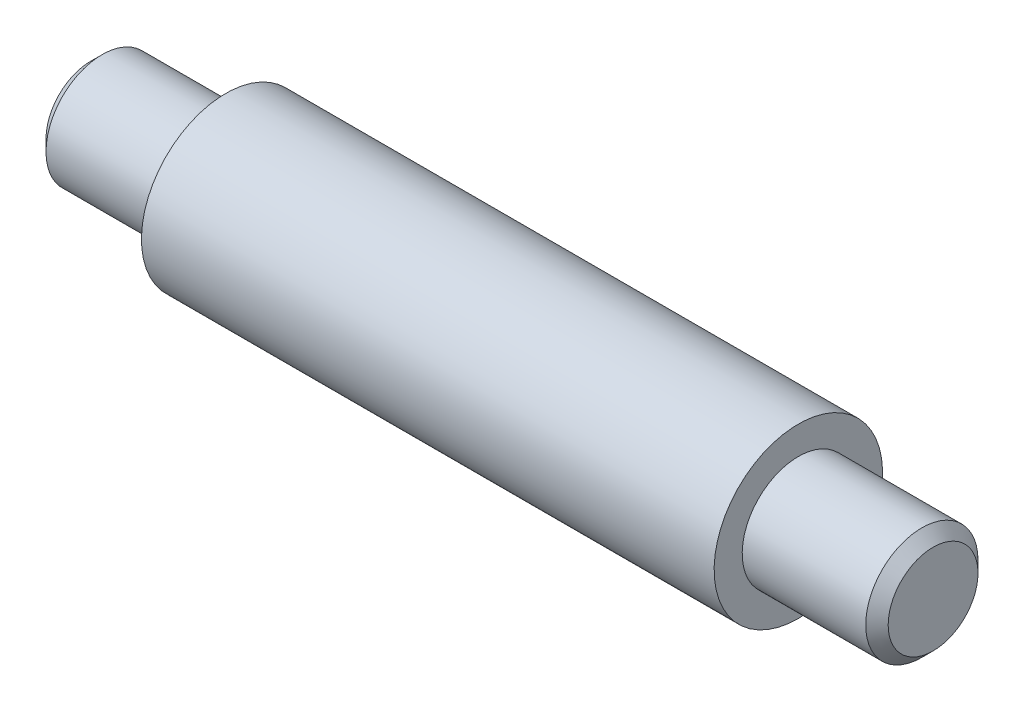
ISO-10303-21;
HEADER;
FILE_DESCRIPTION(('STEP AP214'),'2;1');
FILE_NAME('part.step','',(''),(''),'','','');
FILE_SCHEMA(('AUTOMOTIVE_DESIGN { 1 0 10303 214 1 1 1 1 }'));
ENDSEC;
DATA;
#1=APPLICATION_CONTEXT('core data for automotive mechanical design processes');
#2=APPLICATION_PROTOCOL_DEFINITION('international standard','automotive_design',2000,#1);
#3=PRODUCT_CONTEXT('',#1,'mechanical');
#4=PRODUCT('Part','Part','',(#3));
#5=PRODUCT_RELATED_PRODUCT_CATEGORY('part','',(#4));
#6=PRODUCT_DEFINITION_FORMATION('','',#4);
#7=PRODUCT_DEFINITION_CONTEXT('part definition',#1,'design');
#8=PRODUCT_DEFINITION('design','',#6,#7);
#9=PRODUCT_DEFINITION_SHAPE('','',#8);
#10=(LENGTH_UNIT() NAMED_UNIT(*) SI_UNIT(.MILLI.,.METRE.));
#11=(NAMED_UNIT(*) PLANE_ANGLE_UNIT() SI_UNIT($,.RADIAN.));
#12=(NAMED_UNIT(*) SI_UNIT($,.STERADIAN.) SOLID_ANGLE_UNIT());
#13=UNCERTAINTY_MEASURE_WITH_UNIT(LENGTH_MEASURE(1.E-05),#10,'distance_accuracy_value','');
#14=(GEOMETRIC_REPRESENTATION_CONTEXT(3) GLOBAL_UNCERTAINTY_ASSIGNED_CONTEXT((#13)) GLOBAL_UNIT_ASSIGNED_CONTEXT((#10,
#11,#12)) REPRESENTATION_CONTEXT('',''));
#15=CARTESIAN_POINT('',(0.,0.,0.));
#16=DIRECTION('',(0.,0.,1.));
#17=DIRECTION('',(1.,0.,0.));
#18=AXIS2_PLACEMENT_3D('',#15,#16,#17);
#19=CARTESIAN_POINT('',(-84.3571229682225,10.,0.));
#20=DIRECTION('',(-1.,0.,0.));
#21=DIRECTION('',(0.,-1.,0.));
#22=AXIS2_PLACEMENT_3D('',#19,#20,#21);
#23=PLANE('',#22);
#24=CARTESIAN_POINT('',(-84.3571229682225,10.,0.));
#25=DIRECTION('',(-1.,0.,0.));
#26=DIRECTION('',(0.,-1.,0.));
#27=AXIS2_PLACEMENT_3D('',#24,#25,#26);
#28=CIRCLE('',#27,8.00000000000004);
#29=CARTESIAN_POINT('',(-84.3571229682225,1.99999999999996,0.));
#30=VERTEX_POINT('',#29);
#31=EDGE_CURVE('E52',#30,#30,#28,.T.);
#32=ORIENTED_EDGE('',*,*,#31,.T.);
#33=EDGE_LOOP('',(#32));
#34=FACE_BOUND('',#33,.T.);
#35=ADVANCED_FACE('F43',(#34),#23,.T.);
#36=CARTESIAN_POINT('',(65.6428770317775,10.,0.));
#37=DIRECTION('',(-1.,0.,0.));
#38=DIRECTION('',(0.,-1.,0.));
#39=AXIS2_PLACEMENT_3D('',#36,#37,#38);
#40=CYLINDRICAL_SURFACE('',#39,10.);
#41=CARTESIAN_POINT('',(-82.3571229682225,10.,0.));
#42=DIRECTION('',(-1.,0.,0.));
#43=DIRECTION('',(0.,0.,1.));
#44=AXIS2_PLACEMENT_3D('',#41,#42,#43);
#45=CIRCLE('',#44,10.);
#46=CARTESIAN_POINT('',(-82.3571229682225,10.,10.));
#47=VERTEX_POINT('',#46);
#48=EDGE_CURVE('E10',#47,#47,#45,.F.);
#49=ORIENTED_EDGE('',*,*,#48,.T.);
#50=EDGE_LOOP('',(#49));
#51=FACE_BOUND('',#50,.T.);
#52=CARTESIAN_POINT('',(-60.3571229682225,10.,0.));
#53=DIRECTION('',(-1.,0.,0.));
#54=DIRECTION('',(0.,-1.,0.));
#55=AXIS2_PLACEMENT_3D('',#52,#53,#54);
#56=CIRCLE('',#55,10.);
#57=CARTESIAN_POINT('',(-60.3571229682225,0.,0.));
#58=VERTEX_POINT('',#57);
#59=EDGE_CURVE('E68',#58,#58,#56,.T.);
#60=ORIENTED_EDGE('',*,*,#59,.T.);
#61=EDGE_LOOP('',(#60));
#62=FACE_BOUND('',#61,.T.);
#63=ADVANCED_FACE('F103',(#51,#62),#40,.T.);
#64=CARTESIAN_POINT('',(-60.3571229682225,0.,0.));
#65=DIRECTION('',(-1.,0.,0.));
#66=DIRECTION('',(0.,-1.,0.));
#67=AXIS2_PLACEMENT_3D('',#64,#65,#66);
#68=PLANE('',#67);
#69=CARTESIAN_POINT('',(-60.3571229682225,10.,0.));
#70=DIRECTION('',(-1.,0.,0.));
#71=DIRECTION('',(0.,-1.,0.));
#72=AXIS2_PLACEMENT_3D('',#69,#70,#71);
#73=CIRCLE('',#72,15.);
#74=CARTESIAN_POINT('',(-60.3571229682225,-4.99999999999999,0.));
#75=VERTEX_POINT('',#74);
#76=EDGE_CURVE('E72',#75,#75,#73,.T.);
#77=ORIENTED_EDGE('',*,*,#76,.T.);
#78=EDGE_LOOP('',(#77));
#79=FACE_BOUND('',#78,.T.);
#80=ORIENTED_EDGE('',*,*,#59,.F.);
#81=EDGE_LOOP('',(#80));
#82=FACE_BOUND('',#81,.T.);
#83=ADVANCED_FACE('F108',(#79,#82),#68,.T.);
#84=CARTESIAN_POINT('',(65.6428770317775,10.,0.));
#85=DIRECTION('',(-1.,0.,0.));
#86=DIRECTION('',(0.,-1.,0.));
#87=AXIS2_PLACEMENT_3D('',#84,#85,#86);
#88=CYLINDRICAL_SURFACE('',#87,15.);
#89=CARTESIAN_POINT('',(41.6428770317775,10.,0.));
#90=DIRECTION('',(-1.,0.,0.));
#91=DIRECTION('',(0.,-1.,0.));
#92=AXIS2_PLACEMENT_3D('',#89,#90,#91);
#93=CIRCLE('',#92,15.);
#94=CARTESIAN_POINT('',(41.6428770317775,-4.99999999999999,0.));
#95=VERTEX_POINT('',#94);
#96=EDGE_CURVE('E76',#95,#95,#93,.T.);
#97=ORIENTED_EDGE('',*,*,#96,.T.);
#98=EDGE_LOOP('',(#97));
#99=FACE_BOUND('',#98,.T.);
#100=ORIENTED_EDGE('',*,*,#76,.F.);
#101=EDGE_LOOP('',(#100));
#102=FACE_BOUND('',#101,.T.);
#103=ADVANCED_FACE('F100',(#99,#102),#88,.T.);
#104=CARTESIAN_POINT('',(41.6428770317775,-4.99999999999999,0.));
#105=DIRECTION('',(1.,0.,0.));
#106=DIRECTION('',(0.,1.,0.));
#107=AXIS2_PLACEMENT_3D('',#104,#105,#106);
#108=PLANE('',#107);
#109=CARTESIAN_POINT('',(41.6428770317775,10.,0.));
#110=DIRECTION('',(-1.,0.,0.));
#111=DIRECTION('',(0.,-1.,0.));
#112=AXIS2_PLACEMENT_3D('',#109,#110,#111);
#113=CIRCLE('',#112,10.);
#114=CARTESIAN_POINT('',(41.6428770317775,0.,0.));
#115=VERTEX_POINT('',#114);
#116=EDGE_CURVE('E80',#115,#115,#113,.T.);
#117=ORIENTED_EDGE('',*,*,#116,.T.);
#118=EDGE_LOOP('',(#117));
#119=FACE_BOUND('',#118,.T.);
#120=ORIENTED_EDGE('',*,*,#96,.F.);
#121=EDGE_LOOP('',(#120));
#122=FACE_BOUND('',#121,.T.);
#123=ADVANCED_FACE('F85',(#119,#122),#108,.T.);
#124=CARTESIAN_POINT('',(65.6428770317775,10.,0.));
#125=DIRECTION('',(-1.,0.,0.));
#126=DIRECTION('',(0.,-1.,0.));
#127=AXIS2_PLACEMENT_3D('',#124,#125,#126);
#128=CYLINDRICAL_SURFACE('',#127,10.);
#129=CARTESIAN_POINT('',(63.6428770317775,10.,0.));
#130=DIRECTION('',(1.,0.,0.));
#131=DIRECTION('',(0.,0.,-1.));
#132=AXIS2_PLACEMENT_3D('',#129,#130,#131);
#133=CIRCLE('',#132,10.);
#134=CARTESIAN_POINT('',(63.6428770317775,10.,-10.));
#135=VERTEX_POINT('',#134);
#136=EDGE_CURVE('E62',#135,#135,#133,.F.);
#137=ORIENTED_EDGE('',*,*,#136,.T.);
#138=EDGE_LOOP('',(#137));
#139=FACE_BOUND('',#138,.T.);
#140=ORIENTED_EDGE('',*,*,#116,.F.);
#141=EDGE_LOOP('',(#140));
#142=FACE_BOUND('',#141,.T.);
#143=ADVANCED_FACE('F88',(#139,#142),#128,.T.);
#144=CARTESIAN_POINT('',(65.6428770317775,0.,0.));
#145=DIRECTION('',(1.,0.,0.));
#146=DIRECTION('',(0.,1.,0.));
#147=AXIS2_PLACEMENT_3D('',#144,#145,#146);
#148=PLANE('',#147);
#149=CARTESIAN_POINT('',(65.6428770317775,10.,0.));
#150=DIRECTION('',(1.,0.,0.));
#151=DIRECTION('',(0.,1.,0.));
#152=AXIS2_PLACEMENT_3D('',#149,#150,#151);
#153=CIRCLE('',#152,8.00000000000004);
#154=CARTESIAN_POINT('',(65.6428770317775,18.,0.));
#155=VERTEX_POINT('',#154);
#156=EDGE_CURVE('E57',#155,#155,#153,.T.);
#157=ORIENTED_EDGE('',*,*,#156,.T.);
#158=EDGE_LOOP('',(#157));
#159=FACE_BOUND('',#158,.T.);
#160=ADVANCED_FACE('F90',(#159),#148,.T.);
#161=CARTESIAN_POINT('',(63.6428770317775,10.,0.));
#162=DIRECTION('',(-1.,0.,0.));
#163=DIRECTION('',(0.,0.,1.));
#164=AXIS2_PLACEMENT_3D('',#161,#162,#163);
#165=CONICAL_SURFACE('',#164,10.,0.785398163397447);
#166=ORIENTED_EDGE('',*,*,#156,.F.);
#167=EDGE_LOOP('',(#166));
#168=FACE_BOUND('',#167,.T.);
#169=ORIENTED_EDGE('',*,*,#136,.F.);
#170=EDGE_LOOP('',(#169));
#171=FACE_BOUND('',#170,.T.);
#172=ADVANCED_FACE('F97',(#168,#171),#165,.T.);
#173=CARTESIAN_POINT('',(-84.3571229682225,10.,0.));
#174=DIRECTION('',(1.,0.,0.));
#175=DIRECTION('',(0.,0.,-1.));
#176=AXIS2_PLACEMENT_3D('',#173,#174,#175);
#177=CONICAL_SURFACE('',#176,8.00000000000004,0.785398163397446);
#178=ORIENTED_EDGE('',*,*,#48,.F.);
#179=EDGE_LOOP('',(#178));
#180=FACE_BOUND('',#179,.T.);
#181=ORIENTED_EDGE('',*,*,#31,.F.);
#182=EDGE_LOOP('',(#181));
#183=FACE_BOUND('',#182,.T.);
#184=ADVANCED_FACE('F46',(#180,#183),#177,.T.);
#185=CLOSED_SHELL('',(#35,#63,#83,#103,#123,#143,#160,#172,#184));
#186=MANIFOLD_SOLID_BREP('B2',#185);
#187=ADVANCED_BREP_SHAPE_REPRESENTATION('',(#18,#186),#14);
#188=SHAPE_DEFINITION_REPRESENTATION(#9,#187);
ENDSEC;
END-ISO-10303-21;
